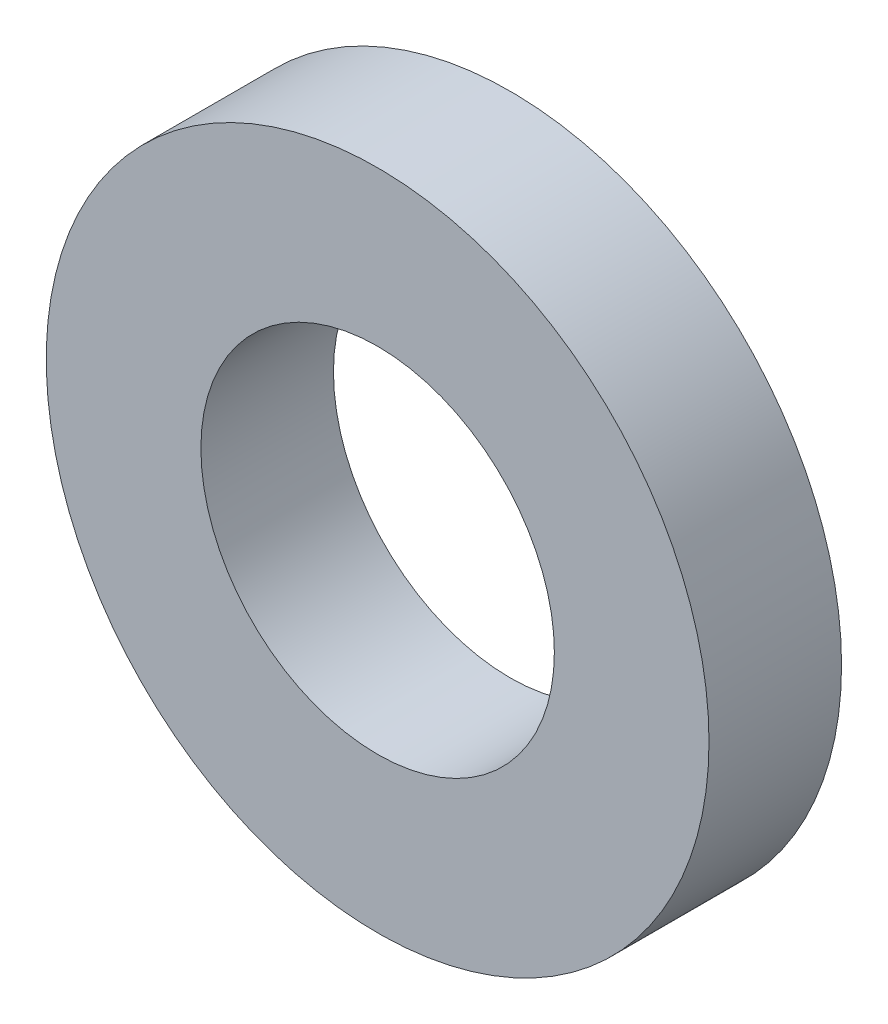
ISO-10303-21;
HEADER;
FILE_DESCRIPTION(('STEP AP214'),'2;1');
FILE_NAME('part.step','',(''),(''),'','','');
FILE_SCHEMA(('AUTOMOTIVE_DESIGN { 1 0 10303 214 1 1 1 1 }'));
ENDSEC;
DATA;
#1=APPLICATION_CONTEXT('core data for automotive mechanical design processes');
#2=APPLICATION_PROTOCOL_DEFINITION('international standard','automotive_design',2000,#1);
#3=PRODUCT_CONTEXT('',#1,'mechanical');
#4=PRODUCT('Part','Part','',(#3));
#5=PRODUCT_RELATED_PRODUCT_CATEGORY('part','',(#4));
#6=PRODUCT_DEFINITION_FORMATION('','',#4);
#7=PRODUCT_DEFINITION_CONTEXT('part definition',#1,'design');
#8=PRODUCT_DEFINITION('design','',#6,#7);
#9=PRODUCT_DEFINITION_SHAPE('','',#8);
#10=(LENGTH_UNIT() NAMED_UNIT(*) SI_UNIT(.MILLI.,.METRE.));
#11=(NAMED_UNIT(*) PLANE_ANGLE_UNIT() SI_UNIT($,.RADIAN.));
#12=(NAMED_UNIT(*) SI_UNIT($,.STERADIAN.) SOLID_ANGLE_UNIT());
#13=UNCERTAINTY_MEASURE_WITH_UNIT(LENGTH_MEASURE(1.E-05),#10,'distance_accuracy_value','');
#14=(GEOMETRIC_REPRESENTATION_CONTEXT(3) GLOBAL_UNCERTAINTY_ASSIGNED_CONTEXT((#13)) GLOBAL_UNIT_ASSIGNED_CONTEXT((#10,
#11,#12)) REPRESENTATION_CONTEXT('',''));
#15=CARTESIAN_POINT('',(0.,0.,0.));
#16=DIRECTION('',(0.,0.,1.));
#17=DIRECTION('',(1.,0.,0.));
#18=AXIS2_PLACEMENT_3D('',#15,#16,#17);
#19=CARTESIAN_POINT('',(0.,0.,1.5));
#20=DIRECTION('',(0.,0.,1.));
#21=DIRECTION('',(1.,0.,0.));
#22=AXIS2_PLACEMENT_3D('',#19,#20,#21);
#23=PLANE('',#22);
#24=CARTESIAN_POINT('',(0.,0.,1.5));
#25=DIRECTION('',(0.,0.,1.));
#26=DIRECTION('',(1.,0.,0.));
#27=AXIS2_PLACEMENT_3D('',#24,#25,#26);
#28=CIRCLE('',#27,7.5);
#29=CARTESIAN_POINT('',(7.5,0.,1.5));
#30=VERTEX_POINT('',#29);
#31=EDGE_CURVE('E12',#30,#30,#28,.T.);
#32=ORIENTED_EDGE('',*,*,#31,.T.);
#33=EDGE_LOOP('',(#32));
#34=FACE_BOUND('',#33,.T.);
#35=CARTESIAN_POINT('',(0.,0.,1.5));
#36=DIRECTION('',(0.,0.,1.));
#37=DIRECTION('',(1.,0.,0.));
#38=AXIS2_PLACEMENT_3D('',#35,#36,#37);
#39=CIRCLE('',#38,4.);
#40=CARTESIAN_POINT('',(4.,0.,1.5));
#41=VERTEX_POINT('',#40);
#42=EDGE_CURVE('E62',#41,#41,#39,.T.);
#43=ORIENTED_EDGE('',*,*,#42,.F.);
#44=EDGE_LOOP('',(#43));
#45=FACE_BOUND('',#44,.T.);
#46=ADVANCED_FACE('F49',(#34,#45),#23,.T.);
#47=CARTESIAN_POINT('',(0.,0.,-1.5));
#48=DIRECTION('',(0.,0.,1.));
#49=DIRECTION('',(1.,0.,0.));
#50=AXIS2_PLACEMENT_3D('',#47,#48,#49);
#51=PLANE('',#50);
#52=CARTESIAN_POINT('',(0.,0.,-1.5));
#53=DIRECTION('',(0.,0.,1.));
#54=DIRECTION('',(1.,0.,0.));
#55=AXIS2_PLACEMENT_3D('',#52,#53,#54);
#56=CIRCLE('',#55,7.5);
#57=CARTESIAN_POINT('',(7.5,0.,-1.5));
#58=VERTEX_POINT('',#57);
#59=EDGE_CURVE('E53',#58,#58,#56,.T.);
#60=ORIENTED_EDGE('',*,*,#59,.F.);
#61=EDGE_LOOP('',(#60));
#62=FACE_BOUND('',#61,.T.);
#63=CARTESIAN_POINT('',(0.,0.,-1.5));
#64=DIRECTION('',(0.,0.,1.));
#65=DIRECTION('',(1.,0.,0.));
#66=AXIS2_PLACEMENT_3D('',#63,#64,#65);
#67=CIRCLE('',#66,4.);
#68=CARTESIAN_POINT('',(4.,0.,-1.5));
#69=VERTEX_POINT('',#68);
#70=EDGE_CURVE('E64',#69,#69,#67,.T.);
#71=ORIENTED_EDGE('',*,*,#70,.T.);
#72=EDGE_LOOP('',(#71));
#73=FACE_BOUND('',#72,.T.);
#74=ADVANCED_FACE('F76',(#62,#73),#51,.F.);
#75=CARTESIAN_POINT('',(0.,0.,1.5));
#76=DIRECTION('',(0.,0.,-1.));
#77=DIRECTION('',(-1.,0.,0.));
#78=AXIS2_PLACEMENT_3D('',#75,#76,#77);
#79=CYLINDRICAL_SURFACE('',#78,7.5);
#80=ORIENTED_EDGE('',*,*,#31,.F.);
#81=EDGE_LOOP('',(#80));
#82=FACE_BOUND('',#81,.T.);
#83=ORIENTED_EDGE('',*,*,#59,.T.);
#84=EDGE_LOOP('',(#83));
#85=FACE_BOUND('',#84,.T.);
#86=ADVANCED_FACE('F51',(#82,#85),#79,.T.);
#87=CARTESIAN_POINT('',(0.,0.,1.5));
#88=DIRECTION('',(0.,0.,-1.));
#89=DIRECTION('',(-1.,0.,0.));
#90=AXIS2_PLACEMENT_3D('',#87,#88,#89);
#91=CYLINDRICAL_SURFACE('',#90,4.);
#92=ORIENTED_EDGE('',*,*,#42,.T.);
#93=EDGE_LOOP('',(#92));
#94=FACE_BOUND('',#93,.T.);
#95=ORIENTED_EDGE('',*,*,#70,.F.);
#96=EDGE_LOOP('',(#95));
#97=FACE_BOUND('',#96,.T.);
#98=ADVANCED_FACE('F72',(#94,#97),#91,.F.);
#99=CLOSED_SHELL('',(#46,#74,#86,#98));
#100=MANIFOLD_SOLID_BREP('B2',#99);
#101=ADVANCED_BREP_SHAPE_REPRESENTATION('',(#18,#100),#14);
#102=SHAPE_DEFINITION_REPRESENTATION(#9,#101);
ENDSEC;
END-ISO-10303-21;
